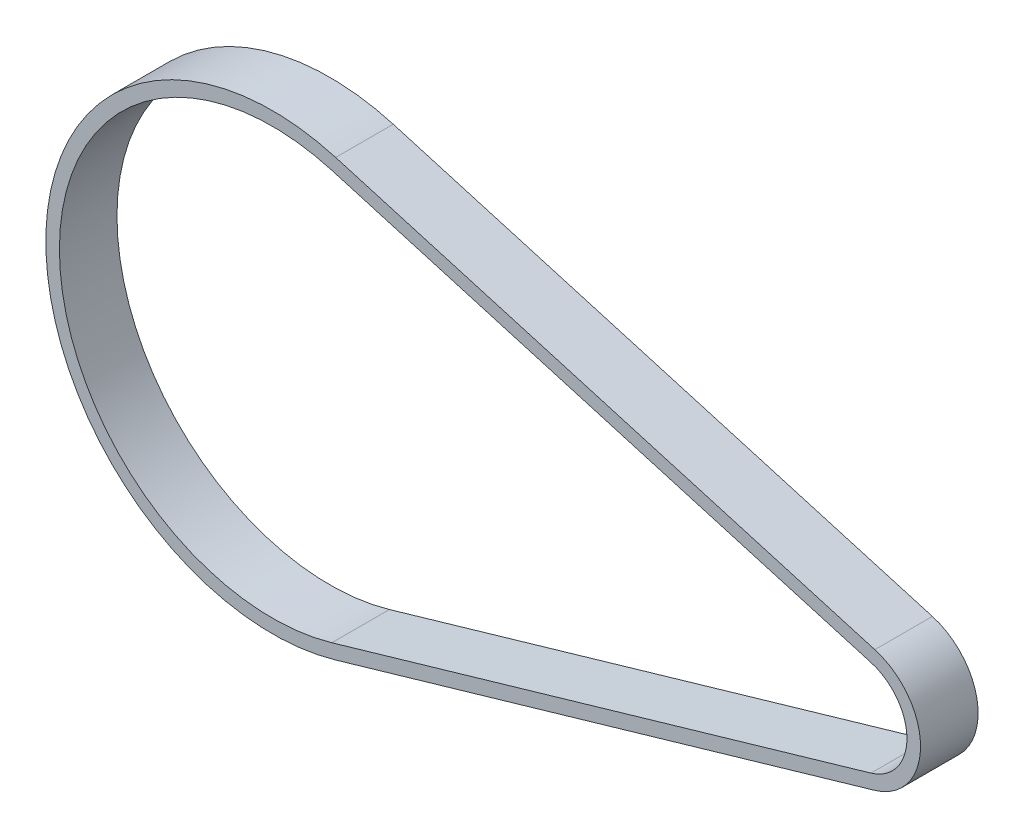
ISO-10303-21;
HEADER;
FILE_DESCRIPTION(('STEP AP214'),'2;1');
FILE_NAME('part.step','',(''),(''),'','','');
FILE_SCHEMA(('AUTOMOTIVE_DESIGN { 1 0 10303 214 1 1 1 1 }'));
ENDSEC;
DATA;
#1=APPLICATION_CONTEXT('core data for automotive mechanical design processes');
#2=APPLICATION_PROTOCOL_DEFINITION('international standard','automotive_design',2000,#1);
#3=PRODUCT_CONTEXT('',#1,'mechanical');
#4=PRODUCT('Part','Part','',(#3));
#5=PRODUCT_RELATED_PRODUCT_CATEGORY('part','',(#4));
#6=PRODUCT_DEFINITION_FORMATION('','',#4);
#7=PRODUCT_DEFINITION_CONTEXT('part definition',#1,'design');
#8=PRODUCT_DEFINITION('design','',#6,#7);
#9=PRODUCT_DEFINITION_SHAPE('','',#8);
#10=(LENGTH_UNIT() NAMED_UNIT(*) SI_UNIT(.MILLI.,.METRE.));
#11=(NAMED_UNIT(*) PLANE_ANGLE_UNIT() SI_UNIT($,.RADIAN.));
#12=(NAMED_UNIT(*) SI_UNIT($,.STERADIAN.) SOLID_ANGLE_UNIT());
#13=UNCERTAINTY_MEASURE_WITH_UNIT(LENGTH_MEASURE(1.E-05),#10,'distance_accuracy_value','');
#14=(GEOMETRIC_REPRESENTATION_CONTEXT(3) GLOBAL_UNCERTAINTY_ASSIGNED_CONTEXT((#13)) GLOBAL_UNIT_ASSIGNED_CONTEXT((#10,
#11,#12)) REPRESENTATION_CONTEXT('',''));
#15=CARTESIAN_POINT('',(0.,0.,0.));
#16=DIRECTION('',(0.,0.,1.));
#17=DIRECTION('',(1.,0.,0.));
#18=AXIS2_PLACEMENT_3D('',#15,#16,#17);
#19=CARTESIAN_POINT('',(-301.648767629192,59.8252545217514,12.7));
#20=DIRECTION('',(0.,0.,1.));
#21=DIRECTION('',(1.,0.,0.));
#22=AXIS2_PLACEMENT_3D('',#19,#20,#21);
#23=PLANE('',#22);
#24=CARTESIAN_POINT('',(-301.648767629192,59.8252545217514,12.7));
#25=DIRECTION('',(0.,0.,1.));
#26=DIRECTION('',(1.,0.,0.));
#27=AXIS2_PLACEMENT_3D('',#24,#25,#26);
#28=CIRCLE('',#27,50.);
#29=CARTESIAN_POINT('',(-287.695279257099,107.838795968409,12.7));
#30=VERTEX_POINT('',#29);
#31=CARTESIAN_POINT('',(-287.6952792571,11.8117130750941,12.7));
#32=VERTEX_POINT('',#31);
#33=EDGE_CURVE('E137',#30,#32,#28,.T.);
#34=ORIENTED_EDGE('',*,*,#33,.T.);
#35=DIRECTION('',(0.960270828933146,0.279069767441851,0.));
#36=VECTOR('',#35,1.);
#37=CARTESIAN_POINT('',(-287.6952792571,11.8117130750941,12.7));
#38=LINE('',#37,#36);
#39=CARTESIAN_POINT('',(-168.741790885005,46.3814629166866,12.7));
#40=VERTEX_POINT('',#39);
#41=EDGE_CURVE('E140',#32,#40,#38,.T.);
#42=ORIENTED_EDGE('',*,*,#41,.T.);
#43=CARTESIAN_POINT('',(-172.648767629191,59.8252545217507,12.7));
#44=DIRECTION('',(0.,0.,1.));
#45=DIRECTION('',(1.,0.,0.));
#46=AXIS2_PLACEMENT_3D('',#43,#44,#45);
#47=CIRCLE('',#46,14.);
#48=CARTESIAN_POINT('',(-168.741790885005,73.2690461268147,12.7));
#49=VERTEX_POINT('',#48);
#50=EDGE_CURVE('E143',#40,#49,#47,.T.);
#51=ORIENTED_EDGE('',*,*,#50,.T.);
#52=DIRECTION('',(-0.960270828933143,0.279069767441862,0.));
#53=VECTOR('',#52,1.);
#54=CARTESIAN_POINT('',(-287.695279257099,107.838795968409,12.7));
#55=LINE('',#54,#53);
#56=EDGE_CURVE('E145',#49,#30,#55,.T.);
#57=ORIENTED_EDGE('',*,*,#56,.T.);
#58=EDGE_LOOP('',(#34,#42,#51,#57));
#59=FACE_BOUND('',#58,.T.);
#60=DIRECTION('',(0.960270828933146,0.279069767441851,0.));
#61=VECTOR('',#60,1.);
#62=CARTESIAN_POINT('',(-288.532488559425,14.6925255618936,12.7));
#63=LINE('',#62,#61);
#64=CARTESIAN_POINT('',(-288.532488559425,14.6925255618936,12.7));
#65=VERTEX_POINT('',#64);
#66=CARTESIAN_POINT('',(-169.57900018733,49.2622754034861,12.7));
#67=VERTEX_POINT('',#66);
#68=EDGE_CURVE('E109',#65,#67,#63,.T.);
#69=ORIENTED_EDGE('',*,*,#68,.F.);
#70=CARTESIAN_POINT('',(-301.648767629192,59.8252545217514,12.7));
#71=DIRECTION('',(0.,0.,1.));
#72=DIRECTION('',(1.,0.,0.));
#73=AXIS2_PLACEMENT_3D('',#70,#71,#72);
#74=CIRCLE('',#73,47.);
#75=CARTESIAN_POINT('',(-288.532488559425,104.957983481609,12.7));
#76=VERTEX_POINT('',#75);
#77=EDGE_CURVE('E101',#76,#65,#74,.T.);
#78=ORIENTED_EDGE('',*,*,#77,.F.);
#79=DIRECTION('',(-0.960270828933143,0.279069767441862,0.));
#80=VECTOR('',#79,1.);
#81=CARTESIAN_POINT('',(-288.532488559425,104.957983481609,12.7));
#82=LINE('',#81,#80);
#83=CARTESIAN_POINT('',(-169.57900018733,70.3882336400153,12.7));
#84=VERTEX_POINT('',#83);
#85=EDGE_CURVE('E123',#84,#76,#82,.T.);
#86=ORIENTED_EDGE('',*,*,#85,.F.);
#87=CARTESIAN_POINT('',(-172.648767629191,59.8252545217507,12.7));
#88=DIRECTION('',(0.,0.,1.));
#89=DIRECTION('',(1.,0.,0.));
#90=AXIS2_PLACEMENT_3D('',#87,#88,#89);
#91=CIRCLE('',#90,11.);
#92=EDGE_CURVE('E121',#67,#84,#91,.T.);
#93=ORIENTED_EDGE('',*,*,#92,.F.);
#94=EDGE_LOOP('',(#69,#78,#86,#93));
#95=FACE_BOUND('',#94,.T.);
#96=ADVANCED_FACE('F36',(#59,#95),#23,.T.);
#97=CARTESIAN_POINT('',(-301.648767629192,59.8252545217514,0.));
#98=DIRECTION('',(0.,0.,1.));
#99=DIRECTION('',(1.,0.,0.));
#100=AXIS2_PLACEMENT_3D('',#97,#98,#99);
#101=PLANE('',#100);
#102=CARTESIAN_POINT('',(-301.648767629192,59.8252545217514,0.));
#103=DIRECTION('',(0.,0.,1.));
#104=DIRECTION('',(1.,0.,0.));
#105=AXIS2_PLACEMENT_3D('',#102,#103,#104);
#106=CIRCLE('',#105,50.);
#107=CARTESIAN_POINT('',(-287.695279257099,107.838795968409,0.));
#108=VERTEX_POINT('',#107);
#109=CARTESIAN_POINT('',(-287.6952792571,11.8117130750941,0.));
#110=VERTEX_POINT('',#109);
#111=EDGE_CURVE('E117',#108,#110,#106,.T.);
#112=ORIENTED_EDGE('',*,*,#111,.F.);
#113=DIRECTION('',(-0.960270828933143,0.279069767441862,0.));
#114=VECTOR('',#113,1.);
#115=CARTESIAN_POINT('',(-287.695279257099,107.838795968409,0.));
#116=LINE('',#115,#114);
#117=CARTESIAN_POINT('',(-168.741790885005,73.2690461268147,0.));
#118=VERTEX_POINT('',#117);
#119=EDGE_CURVE('E141',#118,#108,#116,.T.);
#120=ORIENTED_EDGE('',*,*,#119,.F.);
#121=CARTESIAN_POINT('',(-172.648767629191,59.8252545217507,0.));
#122=DIRECTION('',(0.,0.,1.));
#123=DIRECTION('',(1.,0.,0.));
#124=AXIS2_PLACEMENT_3D('',#121,#122,#123);
#125=CIRCLE('',#124,14.);
#126=CARTESIAN_POINT('',(-168.741790885005,46.3814629166866,0.));
#127=VERTEX_POINT('',#126);
#128=EDGE_CURVE('E152',#127,#118,#125,.T.);
#129=ORIENTED_EDGE('',*,*,#128,.F.);
#130=DIRECTION('',(0.960270828933146,0.279069767441851,0.));
#131=VECTOR('',#130,1.);
#132=CARTESIAN_POINT('',(-287.6952792571,11.8117130750941,0.));
#133=LINE('',#132,#131);
#134=EDGE_CURVE('E150',#110,#127,#133,.T.);
#135=ORIENTED_EDGE('',*,*,#134,.F.);
#136=EDGE_LOOP('',(#112,#120,#129,#135));
#137=FACE_BOUND('',#136,.T.);
#138=CARTESIAN_POINT('',(-301.648767629192,59.8252545217514,0.));
#139=DIRECTION('',(0.,0.,1.));
#140=DIRECTION('',(1.,0.,0.));
#141=AXIS2_PLACEMENT_3D('',#138,#139,#140);
#142=CIRCLE('',#141,47.);
#143=CARTESIAN_POINT('',(-288.532488559425,104.957983481609,0.));
#144=VERTEX_POINT('',#143);
#145=CARTESIAN_POINT('',(-288.532488559425,14.6925255618936,0.));
#146=VERTEX_POINT('',#145);
#147=EDGE_CURVE('E59',#144,#146,#142,.T.);
#148=ORIENTED_EDGE('',*,*,#147,.T.);
#149=DIRECTION('',(0.960270828933146,0.279069767441851,0.));
#150=VECTOR('',#149,1.);
#151=CARTESIAN_POINT('',(-288.532488559425,14.6925255618936,0.));
#152=LINE('',#151,#150);
#153=CARTESIAN_POINT('',(-169.57900018733,49.2622754034861,0.));
#154=VERTEX_POINT('',#153);
#155=EDGE_CURVE('E116',#146,#154,#152,.T.);
#156=ORIENTED_EDGE('',*,*,#155,.T.);
#157=CARTESIAN_POINT('',(-172.648767629191,59.8252545217507,0.));
#158=DIRECTION('',(0.,0.,1.));
#159=DIRECTION('',(1.,0.,0.));
#160=AXIS2_PLACEMENT_3D('',#157,#158,#159);
#161=CIRCLE('',#160,11.);
#162=CARTESIAN_POINT('',(-169.57900018733,70.3882336400153,0.));
#163=VERTEX_POINT('',#162);
#164=EDGE_CURVE('E129',#154,#163,#161,.T.);
#165=ORIENTED_EDGE('',*,*,#164,.T.);
#166=DIRECTION('',(-0.960270828933143,0.279069767441862,0.));
#167=VECTOR('',#166,1.);
#168=CARTESIAN_POINT('',(-288.532488559425,104.957983481609,0.));
#169=LINE('',#168,#167);
#170=EDGE_CURVE('E110',#163,#144,#169,.T.);
#171=ORIENTED_EDGE('',*,*,#170,.T.);
#172=EDGE_LOOP('',(#148,#156,#165,#171));
#173=FACE_BOUND('',#172,.T.);
#174=ADVANCED_FACE('F170',(#137,#173),#101,.F.);
#175=CARTESIAN_POINT('',(-301.648767629192,59.8252545217514,12.7));
#176=DIRECTION('',(0.,0.,-1.));
#177=DIRECTION('',(-1.,0.,0.));
#178=AXIS2_PLACEMENT_3D('',#175,#176,#177);
#179=CYLINDRICAL_SURFACE('',#178,50.);
#180=ORIENTED_EDGE('',*,*,#111,.T.);
#181=DIRECTION('',(0.,0.,-1.));
#182=VECTOR('',#181,1.);
#183=CARTESIAN_POINT('',(-287.6952792571,11.8117130750941,12.7));
#184=LINE('',#183,#182);
#185=EDGE_CURVE('E11',#32,#110,#184,.T.);
#186=ORIENTED_EDGE('',*,*,#185,.F.);
#187=ORIENTED_EDGE('',*,*,#33,.F.);
#188=DIRECTION('',(0.,0.,-1.));
#189=VECTOR('',#188,1.);
#190=CARTESIAN_POINT('',(-287.695279257099,107.838795968409,12.7));
#191=LINE('',#190,#189);
#192=EDGE_CURVE('E147',#30,#108,#191,.T.);
#193=ORIENTED_EDGE('',*,*,#192,.T.);
#194=EDGE_LOOP('',(#180,#186,#187,#193));
#195=FACE_BOUND('',#194,.T.);
#196=ADVANCED_FACE('F38',(#195),#179,.T.);
#197=CARTESIAN_POINT('',(-287.6952792571,11.8117130750941,12.7));
#198=DIRECTION('',(-0.279069767441851,0.960270828933146,0.));
#199=DIRECTION('',(-0.960270828933146,-0.279069767441851,0.));
#200=AXIS2_PLACEMENT_3D('',#197,#198,#199);
#201=PLANE('',#200);
#202=ORIENTED_EDGE('',*,*,#134,.T.);
#203=DIRECTION('',(0.,0.,-1.));
#204=VECTOR('',#203,1.);
#205=CARTESIAN_POINT('',(-168.741790885005,46.3814629166866,12.7));
#206=LINE('',#205,#204);
#207=EDGE_CURVE('E44',#40,#127,#206,.T.);
#208=ORIENTED_EDGE('',*,*,#207,.F.);
#209=ORIENTED_EDGE('',*,*,#41,.F.);
#210=ORIENTED_EDGE('',*,*,#185,.T.);
#211=EDGE_LOOP('',(#202,#208,#209,#210));
#212=FACE_BOUND('',#211,.T.);
#213=ADVANCED_FACE('F180',(#212),#201,.F.);
#214=CARTESIAN_POINT('',(-172.648767629191,59.8252545217507,12.7));
#215=DIRECTION('',(0.,0.,-1.));
#216=DIRECTION('',(-1.,0.,0.));
#217=AXIS2_PLACEMENT_3D('',#214,#215,#216);
#218=CYLINDRICAL_SURFACE('',#217,14.);
#219=ORIENTED_EDGE('',*,*,#128,.T.);
#220=DIRECTION('',(0.,0.,-1.));
#221=VECTOR('',#220,1.);
#222=CARTESIAN_POINT('',(-168.741790885005,73.2690461268147,12.7));
#223=LINE('',#222,#221);
#224=EDGE_CURVE('E157',#49,#118,#223,.T.);
#225=ORIENTED_EDGE('',*,*,#224,.F.);
#226=ORIENTED_EDGE('',*,*,#50,.F.);
#227=ORIENTED_EDGE('',*,*,#207,.T.);
#228=EDGE_LOOP('',(#219,#225,#226,#227));
#229=FACE_BOUND('',#228,.T.);
#230=ADVANCED_FACE('F164',(#229),#218,.T.);
#231=CARTESIAN_POINT('',(-287.695279257099,107.838795968409,12.7));
#232=DIRECTION('',(-0.279069767441862,-0.960270828933143,0.));
#233=DIRECTION('',(0.960270828933143,-0.279069767441862,0.));
#234=AXIS2_PLACEMENT_3D('',#231,#232,#233);
#235=PLANE('',#234);
#236=ORIENTED_EDGE('',*,*,#119,.T.);
#237=ORIENTED_EDGE('',*,*,#192,.F.);
#238=ORIENTED_EDGE('',*,*,#56,.F.);
#239=ORIENTED_EDGE('',*,*,#224,.T.);
#240=EDGE_LOOP('',(#236,#237,#238,#239));
#241=FACE_BOUND('',#240,.T.);
#242=ADVANCED_FACE('F174',(#241),#235,.F.);
#243=CARTESIAN_POINT('',(-301.648767629192,59.8252545217514,12.7));
#244=DIRECTION('',(0.,0.,-1.));
#245=DIRECTION('',(-1.,0.,0.));
#246=AXIS2_PLACEMENT_3D('',#243,#244,#245);
#247=CYLINDRICAL_SURFACE('',#246,47.);
#248=ORIENTED_EDGE('',*,*,#147,.F.);
#249=DIRECTION('',(0.,0.,-1.));
#250=VECTOR('',#249,1.);
#251=CARTESIAN_POINT('',(-288.532488559425,104.957983481609,12.7));
#252=LINE('',#251,#250);
#253=EDGE_CURVE('E105',#76,#144,#252,.T.);
#254=ORIENTED_EDGE('',*,*,#253,.F.);
#255=ORIENTED_EDGE('',*,*,#77,.T.);
#256=DIRECTION('',(0.,0.,-1.));
#257=VECTOR('',#256,1.);
#258=CARTESIAN_POINT('',(-288.532488559425,14.6925255618936,12.7));
#259=LINE('',#258,#257);
#260=EDGE_CURVE('E104',#65,#146,#259,.T.);
#261=ORIENTED_EDGE('',*,*,#260,.T.);
#262=EDGE_LOOP('',(#248,#254,#255,#261));
#263=FACE_BOUND('',#262,.T.);
#264=ADVANCED_FACE('F103',(#263),#247,.F.);
#265=CARTESIAN_POINT('',(-288.532488559425,14.6925255618936,12.7));
#266=DIRECTION('',(-0.279069767441851,0.960270828933146,0.));
#267=DIRECTION('',(-0.960270828933146,-0.279069767441851,0.));
#268=AXIS2_PLACEMENT_3D('',#265,#266,#267);
#269=PLANE('',#268);
#270=ORIENTED_EDGE('',*,*,#155,.F.);
#271=ORIENTED_EDGE('',*,*,#260,.F.);
#272=ORIENTED_EDGE('',*,*,#68,.T.);
#273=DIRECTION('',(0.,0.,-1.));
#274=VECTOR('',#273,1.);
#275=CARTESIAN_POINT('',(-169.57900018733,49.2622754034861,12.7));
#276=LINE('',#275,#274);
#277=EDGE_CURVE('E118',#67,#154,#276,.T.);
#278=ORIENTED_EDGE('',*,*,#277,.T.);
#279=EDGE_LOOP('',(#270,#271,#272,#278));
#280=FACE_BOUND('',#279,.T.);
#281=ADVANCED_FACE('F113',(#280),#269,.T.);
#282=CARTESIAN_POINT('',(-172.648767629191,59.8252545217507,12.7));
#283=DIRECTION('',(0.,0.,-1.));
#284=DIRECTION('',(-1.,0.,0.));
#285=AXIS2_PLACEMENT_3D('',#282,#283,#284);
#286=CYLINDRICAL_SURFACE('',#285,11.);
#287=ORIENTED_EDGE('',*,*,#164,.F.);
#288=ORIENTED_EDGE('',*,*,#277,.F.);
#289=ORIENTED_EDGE('',*,*,#92,.T.);
#290=DIRECTION('',(0.,0.,-1.));
#291=VECTOR('',#290,1.);
#292=CARTESIAN_POINT('',(-169.57900018733,70.3882336400153,12.7));
#293=LINE('',#292,#291);
#294=EDGE_CURVE('E51',#84,#163,#293,.T.);
#295=ORIENTED_EDGE('',*,*,#294,.T.);
#296=EDGE_LOOP('',(#287,#288,#289,#295));
#297=FACE_BOUND('',#296,.T.);
#298=ADVANCED_FACE('F203',(#297),#286,.F.);
#299=CARTESIAN_POINT('',(-288.532488559425,104.957983481609,12.7));
#300=DIRECTION('',(-0.279069767441862,-0.960270828933143,0.));
#301=DIRECTION('',(0.960270828933143,-0.279069767441862,0.));
#302=AXIS2_PLACEMENT_3D('',#299,#300,#301);
#303=PLANE('',#302);
#304=ORIENTED_EDGE('',*,*,#170,.F.);
#305=ORIENTED_EDGE('',*,*,#294,.F.);
#306=ORIENTED_EDGE('',*,*,#85,.T.);
#307=ORIENTED_EDGE('',*,*,#253,.T.);
#308=EDGE_LOOP('',(#304,#305,#306,#307));
#309=FACE_BOUND('',#308,.T.);
#310=ADVANCED_FACE('F207',(#309),#303,.T.);
#311=CLOSED_SHELL('',(#96,#174,#196,#213,#230,#242,#264,#281,#298,#310));
#312=MANIFOLD_SOLID_BREP('B2',#311);
#313=ADVANCED_BREP_SHAPE_REPRESENTATION('',(#18,#312),#14);
#314=SHAPE_DEFINITION_REPRESENTATION(#9,#313);
ENDSEC;
END-ISO-10303-21;
